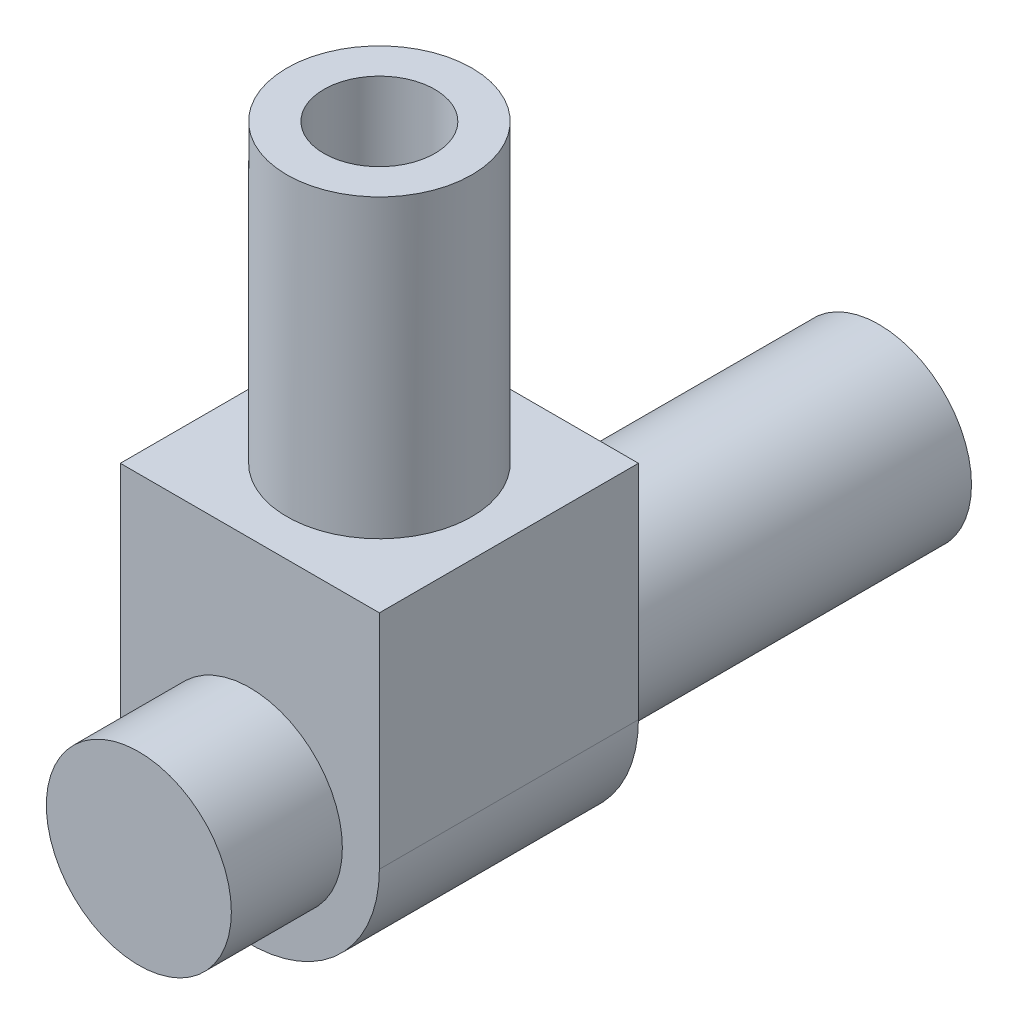
ISO-10303-21;
HEADER;
FILE_DESCRIPTION(('STEP AP214'),'2;1');
FILE_NAME('part.step','',(''),(''),'','','');
FILE_SCHEMA(('AUTOMOTIVE_DESIGN { 1 0 10303 214 1 1 1 1 }'));
ENDSEC;
DATA;
#1=APPLICATION_CONTEXT('core data for automotive mechanical design processes');
#2=APPLICATION_PROTOCOL_DEFINITION('international standard','automotive_design',2000,#1);
#3=PRODUCT_CONTEXT('',#1,'mechanical');
#4=PRODUCT('Part','Part','',(#3));
#5=PRODUCT_RELATED_PRODUCT_CATEGORY('part','',(#4));
#6=PRODUCT_DEFINITION_FORMATION('','',#4);
#7=PRODUCT_DEFINITION_CONTEXT('part definition',#1,'design');
#8=PRODUCT_DEFINITION('design','',#6,#7);
#9=PRODUCT_DEFINITION_SHAPE('','',#8);
#10=(LENGTH_UNIT() NAMED_UNIT(*) SI_UNIT(.MILLI.,.METRE.));
#11=(NAMED_UNIT(*) PLANE_ANGLE_UNIT() SI_UNIT($,.RADIAN.));
#12=(NAMED_UNIT(*) SI_UNIT($,.STERADIAN.) SOLID_ANGLE_UNIT());
#13=UNCERTAINTY_MEASURE_WITH_UNIT(LENGTH_MEASURE(1.E-05),#10,'distance_accuracy_value','');
#14=(GEOMETRIC_REPRESENTATION_CONTEXT(3) GLOBAL_UNCERTAINTY_ASSIGNED_CONTEXT((#13)) GLOBAL_UNIT_ASSIGNED_CONTEXT((#10,
#11,#12)) REPRESENTATION_CONTEXT('',''));
#15=CARTESIAN_POINT('',(0.,0.,0.));
#16=DIRECTION('',(0.,0.,1.));
#17=DIRECTION('',(1.,0.,0.));
#18=AXIS2_PLACEMENT_3D('',#15,#16,#17);
#19=CARTESIAN_POINT('',(-3.5,6.,7.));
#20=DIRECTION('',(0.,-1.,0.));
#21=DIRECTION('',(0.,0.,-1.));
#22=AXIS2_PLACEMENT_3D('',#19,#20,#21);
#23=PLANE('',#22);
#24=DIRECTION('',(-1.,0.,0.));
#25=VECTOR('',#24,1.);
#26=CARTESIAN_POINT('',(-3.5,6.,0.));
#27=LINE('',#26,#25);
#28=CARTESIAN_POINT('',(3.5,6.,0.));
#29=VERTEX_POINT('',#28);
#30=CARTESIAN_POINT('',(-3.5,6.,0.));
#31=VERTEX_POINT('',#30);
#32=EDGE_CURVE('E71',#29,#31,#27,.T.);
#33=ORIENTED_EDGE('',*,*,#32,.T.);
#34=DIRECTION('',(0.,0.,-1.));
#35=VECTOR('',#34,1.);
#36=CARTESIAN_POINT('',(-3.5,6.,7.));
#37=LINE('',#36,#35);
#38=CARTESIAN_POINT('',(-3.5,6.,7.));
#39=VERTEX_POINT('',#38);
#40=EDGE_CURVE('E98',#39,#31,#37,.T.);
#41=ORIENTED_EDGE('',*,*,#40,.F.);
#42=DIRECTION('',(-1.,0.,0.));
#43=VECTOR('',#42,1.);
#44=CARTESIAN_POINT('',(-3.5,6.,7.));
#45=LINE('',#44,#43);
#46=CARTESIAN_POINT('',(3.5,6.,7.));
#47=VERTEX_POINT('',#46);
#48=EDGE_CURVE('E89',#47,#39,#45,.T.);
#49=ORIENTED_EDGE('',*,*,#48,.F.);
#50=DIRECTION('',(0.,0.,-1.));
#51=VECTOR('',#50,1.);
#52=CARTESIAN_POINT('',(3.5,6.,7.));
#53=LINE('',#52,#51);
#54=EDGE_CURVE('E94',#47,#29,#53,.T.);
#55=ORIENTED_EDGE('',*,*,#54,.T.);
#56=EDGE_LOOP('',(#33,#41,#49,#55));
#57=FACE_BOUND('',#56,.T.);
#58=CARTESIAN_POINT('',(0.,6.,3.5));
#59=DIRECTION('',(0.,-1.,0.));
#60=DIRECTION('',(0.,0.,-1.));
#61=AXIS2_PLACEMENT_3D('',#58,#59,#60);
#62=CIRCLE('',#61,2.5);
#63=CARTESIAN_POINT('',(0.,6.,1.));
#64=VERTEX_POINT('',#63);
#65=EDGE_CURVE('E46',#64,#64,#62,.F.);
#66=ORIENTED_EDGE('',*,*,#65,.F.);
#67=EDGE_LOOP('',(#66));
#68=FACE_BOUND('',#67,.T.);
#69=ADVANCED_FACE('F33',(#57,#68),#23,.F.);
#70=CARTESIAN_POINT('',(0.,0.,0.));
#71=DIRECTION('',(0.,0.,1.));
#72=DIRECTION('',(1.,0.,0.));
#73=AXIS2_PLACEMENT_3D('',#70,#71,#72);
#74=PLANE('',#73);
#75=CARTESIAN_POINT('',(0.,0.,0.));
#76=DIRECTION('',(0.,0.,1.));
#77=DIRECTION('',(1.,0.,0.));
#78=AXIS2_PLACEMENT_3D('',#75,#76,#77);
#79=CIRCLE('',#78,3.5);
#80=CARTESIAN_POINT('',(-3.5,0.,0.));
#81=VERTEX_POINT('',#80);
#82=CARTESIAN_POINT('',(3.5,0.,0.));
#83=VERTEX_POINT('',#82);
#84=EDGE_CURVE('E106',#81,#83,#79,.T.);
#85=ORIENTED_EDGE('',*,*,#84,.F.);
#86=DIRECTION('',(0.,-1.,0.));
#87=VECTOR('',#86,1.);
#88=CARTESIAN_POINT('',(-3.5,0.,0.));
#89=LINE('',#88,#87);
#90=EDGE_CURVE('E77',#31,#81,#89,.T.);
#91=ORIENTED_EDGE('',*,*,#90,.F.);
#92=ORIENTED_EDGE('',*,*,#32,.F.);
#93=DIRECTION('',(0.,1.,0.));
#94=VECTOR('',#93,1.);
#95=CARTESIAN_POINT('',(3.5,6.,0.));
#96=LINE('',#95,#94);
#97=EDGE_CURVE('E96',#83,#29,#96,.T.);
#98=ORIENTED_EDGE('',*,*,#97,.F.);
#99=EDGE_LOOP('',(#85,#91,#92,#98));
#100=FACE_BOUND('',#99,.T.);
#101=CARTESIAN_POINT('',(0.,0.,0.));
#102=DIRECTION('',(0.,0.,1.));
#103=DIRECTION('',(1.,0.,0.));
#104=AXIS2_PLACEMENT_3D('',#101,#102,#103);
#105=CIRCLE('',#104,2.5);
#106=CARTESIAN_POINT('',(2.5,0.,0.));
#107=VERTEX_POINT('',#106);
#108=EDGE_CURVE('E116',#107,#107,#105,.F.);
#109=ORIENTED_EDGE('',*,*,#108,.F.);
#110=EDGE_LOOP('',(#109));
#111=FACE_BOUND('',#110,.T.);
#112=ADVANCED_FACE('F123',(#100,#111),#74,.F.);
#113=CARTESIAN_POINT('',(0.,0.,7.));
#114=DIRECTION('',(0.,0.,1.));
#115=DIRECTION('',(1.,0.,0.));
#116=AXIS2_PLACEMENT_3D('',#113,#114,#115);
#117=PLANE('',#116);
#118=CARTESIAN_POINT('',(0.,0.,7.));
#119=DIRECTION('',(0.,0.,1.));
#120=DIRECTION('',(1.,0.,0.));
#121=AXIS2_PLACEMENT_3D('',#118,#119,#120);
#122=CIRCLE('',#121,3.5);
#123=CARTESIAN_POINT('',(-3.5,0.,7.));
#124=VERTEX_POINT('',#123);
#125=CARTESIAN_POINT('',(3.5,0.,7.));
#126=VERTEX_POINT('',#125);
#127=EDGE_CURVE('E91',#124,#126,#122,.T.);
#128=ORIENTED_EDGE('',*,*,#127,.T.);
#129=DIRECTION('',(0.,1.,0.));
#130=VECTOR('',#129,1.);
#131=CARTESIAN_POINT('',(3.5,6.,7.));
#132=LINE('',#131,#130);
#133=EDGE_CURVE('E85',#126,#47,#132,.T.);
#134=ORIENTED_EDGE('',*,*,#133,.T.);
#135=ORIENTED_EDGE('',*,*,#48,.T.);
#136=DIRECTION('',(0.,-1.,0.));
#137=VECTOR('',#136,1.);
#138=CARTESIAN_POINT('',(-3.5,0.,7.));
#139=LINE('',#138,#137);
#140=EDGE_CURVE('E54',#39,#124,#139,.T.);
#141=ORIENTED_EDGE('',*,*,#140,.T.);
#142=EDGE_LOOP('',(#128,#134,#135,#141));
#143=FACE_BOUND('',#142,.T.);
#144=CARTESIAN_POINT('',(0.,0.,7.));
#145=DIRECTION('',(0.,0.,1.));
#146=DIRECTION('',(1.,0.,0.));
#147=AXIS2_PLACEMENT_3D('',#144,#145,#146);
#148=CIRCLE('',#147,2.5);
#149=CARTESIAN_POINT('',(2.5,0.,7.));
#150=VERTEX_POINT('',#149);
#151=EDGE_CURVE('E176',#150,#150,#148,.T.);
#152=ORIENTED_EDGE('',*,*,#151,.F.);
#153=EDGE_LOOP('',(#152));
#154=FACE_BOUND('',#153,.T.);
#155=ADVANCED_FACE('F86',(#143,#154),#117,.T.);
#156=CARTESIAN_POINT('',(0.,0.,7.));
#157=DIRECTION('',(0.,0.,-1.));
#158=DIRECTION('',(-1.,0.,0.));
#159=AXIS2_PLACEMENT_3D('',#156,#157,#158);
#160=CYLINDRICAL_SURFACE('',#159,3.5);
#161=CARTESIAN_POINT('',(0.,-3.5,5.));
#162=CARTESIAN_POINT('',(0.0801521976824057,-3.49999299268884,4.99999077856102));
#163=CARTESIAN_POINT('',(0.160419992198245,-3.4972151640971,4.9935378702444));
#164=CARTESIAN_POINT('',(0.318671611361215,-3.48637069204865,4.96796029271462));
#165=CARTESIAN_POINT('',(0.396649149090578,-3.47829069608751,4.94880363021045));
#166=CARTESIAN_POINT('',(0.547768164746412,-3.45770786336707,4.89866472480102));
#167=CARTESIAN_POINT('',(0.620925386146736,-3.44522036823866,4.86772347253735));
#168=CARTESIAN_POINT('',(0.760936446071886,-3.41702837926819,4.79506789624952));
#169=CARTESIAN_POINT('',(0.827791985611416,-3.40132475720839,4.75335649084902));
#170=CARTESIAN_POINT('',(0.956920783546127,-3.36733908702934,4.65803614587467));
#171=CARTESIAN_POINT('',(1.01882024425246,-3.34896947381213,4.60395236192237));
#172=CARTESIAN_POINT('',(1.13299518436931,-3.3120882776969,4.48642807388386));
#173=CARTESIAN_POINT('',(1.18526532055665,-3.29357662187922,4.42298240992972));
#174=CARTESIAN_POINT('',(1.28142843548186,-3.25741027462364,4.28448363629348));
#175=CARTESIAN_POINT('',(1.32473406006014,-3.23985230076501,4.20899477035753));
#176=CARTESIAN_POINT('',(1.39786599574425,-3.2089808436345,4.05094528653299));
#177=CARTESIAN_POINT('',(1.42769964537364,-3.19566505070703,3.96838854791987));
#178=CARTESIAN_POINT('',(1.47147459991436,-3.17573899533535,3.80284963069055));
#179=CARTESIAN_POINT('',(1.48613747209695,-3.16882610719817,3.72009614907264));
#180=CARTESIAN_POINT('',(1.50140303570396,-3.16162424842019,3.55303701523244));
#181=CARTESIAN_POINT('',(1.50201414304565,-3.16133131294301,3.46873232235007));
#182=CARTESIAN_POINT('',(1.48969999758096,-3.16714786968021,3.30835004815122));
#183=CARTESIAN_POINT('',(1.47788056910827,-3.17273435527608,3.23216468839374));
#184=CARTESIAN_POINT('',(1.44290386406528,-3.18879205821456,3.08298620711097));
#185=CARTESIAN_POINT('',(1.41974426417223,-3.19926427650311,3.00999374307123));
#186=CARTESIAN_POINT('',(1.36228829534658,-3.22415342810443,2.86737642426223));
#187=CARTESIAN_POINT('',(1.32775987214028,-3.23865147551049,2.79785985288551));
#188=CARTESIAN_POINT('',(1.24871152436691,-3.26994246945713,2.66532683797071));
#189=CARTESIAN_POINT('',(1.20418753740296,-3.28673634798109,2.60231305253676));
#190=CARTESIAN_POINT('',(1.10171702696058,-3.32256202266195,2.47861124818766));
#191=CARTESIAN_POINT('',(1.04292364428052,-3.34165927694226,2.41864163526357));
#192=CARTESIAN_POINT('',(0.915936662025533,-3.3786730287964,2.30916420467247));
#193=CARTESIAN_POINT('',(0.847740608139989,-3.39658921627429,2.25965912706102));
#194=CARTESIAN_POINT('',(0.701592911506315,-3.4297984684468,2.17137803359639));
#195=CARTESIAN_POINT('',(0.623435574851147,-3.44501227516835,2.13291049064718));
#196=CARTESIAN_POINT('',(0.460939847079478,-3.47048698130307,2.06992488119267));
#197=CARTESIAN_POINT('',(0.376605107828833,-3.48075078019997,2.04539864701116));
#198=CARTESIAN_POINT('',(0.210138119470685,-3.49461763446686,2.01253306977051));
#199=CARTESIAN_POINT('',(0.12822898050547,-3.49861624982293,2.00323061734281));
#200=CARTESIAN_POINT('',(-0.0360716505592618,-3.50077708325871,1.99818521179588));
#201=CARTESIAN_POINT('',(-0.118462985950311,-3.49894110265833,2.0024380737338));
#202=CARTESIAN_POINT('',(-0.276771219813305,-3.48989338160075,2.02370781602742));
#203=CARTESIAN_POINT('',(-0.352799465751996,-3.48297259736823,2.0400341607242));
#204=CARTESIAN_POINT('',(-0.500945568196324,-3.46476944004986,2.08401044711904));
#205=CARTESIAN_POINT('',(-0.573062936850433,-3.45348652424256,2.11166179786093));
#206=CARTESIAN_POINT('',(-0.713888482619006,-3.42719375756864,2.17840057975122));
#207=CARTESIAN_POINT('',(-0.782419874757532,-3.41207852694255,2.21781816511362));
#208=CARTESIAN_POINT('',(-0.912142452825177,-3.37971494195701,2.30660947223738));
#209=CARTESIAN_POINT('',(-0.973330487571132,-3.36246567824312,2.35598744400943));
#210=CARTESIAN_POINT('',(-1.09148379765634,-3.32607394349023,2.46764479392383));
#211=CARTESIAN_POINT('',(-1.14778308774279,-3.30688677499573,2.53061610503989));
#212=CARTESIAN_POINT('',(-1.24921715724402,-3.26992018844849,2.66539114930661));
#213=CARTESIAN_POINT('',(-1.29434883220193,-3.25214116277359,2.737197330153));
#214=CARTESIAN_POINT('',(-1.37281937806384,-3.21981484643715,2.88940692651431));
#215=CARTESIAN_POINT('',(-1.40593207473353,-3.20533127997694,2.96994150465684));
#216=CARTESIAN_POINT('',(-1.45782942550893,-3.18206803761103,3.13626316323802));
#217=CARTESIAN_POINT('',(-1.47662682249981,-3.17328328988834,3.22204549867058));
#218=CARTESIAN_POINT('',(-1.49805974083905,-3.16321740581935,3.38899558661863));
#219=CARTESIAN_POINT('',(-1.50187346166243,-3.1613896288168,3.46997963537981));
#220=CARTESIAN_POINT('',(-1.49641325085791,-3.16397809086751,3.63139487183152));
#221=CARTESIAN_POINT('',(-1.48714162748686,-3.16839322866983,3.7118261545153));
#222=CARTESIAN_POINT('',(-1.45678214099438,-3.1824582711803,3.86552085386623));
#223=CARTESIAN_POINT('',(-1.43633482013379,-3.19182357178317,3.93893941664732));
#224=CARTESIAN_POINT('',(-1.38485117000437,-3.21449437287189,4.08131036217406));
#225=CARTESIAN_POINT('',(-1.35381183006239,-3.22780099349552,4.15026146845329));
#226=CARTESIAN_POINT('',(-1.27981602227022,-3.25787626150961,4.2864104369083));
#227=CARTESIAN_POINT('',(-1.23624027712768,-3.2748083433963,4.35323489382022));
#228=CARTESIAN_POINT('',(-1.13924888881305,-3.3097987990854,4.47899086353089));
#229=CARTESIAN_POINT('',(-1.08582952534294,-3.32785759700647,4.53791937754398));
#230=CARTESIAN_POINT('',(-0.965671675541754,-3.36477750877144,4.65100309731437));
#231=CARTESIAN_POINT('',(-0.898214817981347,-3.38358948911939,4.70441473386853));
#232=CARTESIAN_POINT('',(-0.754612613706939,-3.41848089249468,4.79921492669314));
#233=CARTESIAN_POINT('',(-0.678463349382714,-3.43455907522587,4.84059803174978));
#234=CARTESIAN_POINT('',(-0.520626802896574,-3.46197513636854,4.90934456957067));
#235=CARTESIAN_POINT('',(-0.4390364028582,-3.47337868320289,4.93690352997931));
#236=CARTESIAN_POINT('',(-0.27192565740434,-3.49042295491408,4.9776347147672));
#237=CARTESIAN_POINT('',(-0.186418352711328,-3.49608152963086,4.99085150964664));
#238=CARTESIAN_POINT('',(-0.0670267606132215,-3.49952115812385,4.99888051095403));
#239=CARTESIAN_POINT('',(-0.0335234910607521,-3.50000293079341,5.0000038568478));
#240=CARTESIAN_POINT('',(0.,-3.5,5.));
#241=B_SPLINE_CURVE_WITH_KNOTS('',3,(#161,#162,#163,#164,#165,#166,#167,#168,#169,#170,#171,
#172,#173,#174,#175,#176,#177,#178,#179,#180,#181,#182,#183,#184,#185,#186,#187,#188,#189,#190,
#191,#192,#193,#194,#195,#196,#197,#198,#199,#200,#201,#202,#203,#204,#205,#206,#207,#208,#209,
#210,#211,#212,#213,#214,#215,#216,#217,#218,#219,#220,#221,#222,#223,#224,#225,#226,#227,#228,
#229,#230,#231,#232,#233,#234,#235,#236,#237,#238,#239,#240),.UNSPECIFIED.,.T.,.F.,(4,2,2,2,2,2,
2,2,2,2,2,2,2,2,2,2,2,2,2,2,2,2,2,2,2,2,2,2,2,2,2,2,2,2,2,2,2,2,2,4),(0.,0.240357161374425,
0.481321951711673,0.721456131375708,0.961525304807656,1.21311371779253,1.46484131710872,
1.72984780430031,1.99470976114131,2.2462971341405,2.49773382188957,2.72855360159806,
2.95942069041216,3.19532704432402,3.43132944942385,3.68854918859162,3.94583619550723,
4.20973622296859,4.47348148178613,4.71978673747256,4.96601595851026,5.19915597113058,
5.43232499957122,5.67277527577345,5.91332836788289,6.17201425189602,6.43077196675482,
6.69417345394932,6.95734019712949,7.19934244432577,7.44130200762144,7.67066022550943,
7.90008369050324,8.14372375039558,8.38745608120077,8.65042084666959,8.91350460007056,
9.17275427816965,9.43119596989053,9.5317248559811),.UNSPECIFIED.);
#242=CARTESIAN_POINT('',(0.,-3.5,5.));
#243=VERTEX_POINT('',#242);
#244=EDGE_CURVE('E11',#243,#243,#241,.T.);
#245=ORIENTED_EDGE('',*,*,#244,.T.);
#246=EDGE_LOOP('',(#245));
#247=FACE_BOUND('',#246,.T.);
#248=ORIENTED_EDGE('',*,*,#84,.T.);
#249=DIRECTION('',(0.,0.,-1.));
#250=VECTOR('',#249,1.);
#251=CARTESIAN_POINT('',(3.5,0.,7.));
#252=LINE('',#251,#250);
#253=EDGE_CURVE('E97',#126,#83,#252,.T.);
#254=ORIENTED_EDGE('',*,*,#253,.F.);
#255=ORIENTED_EDGE('',*,*,#127,.F.);
#256=DIRECTION('',(0.,0.,-1.));
#257=VECTOR('',#256,1.);
#258=CARTESIAN_POINT('',(-3.5,0.,7.));
#259=LINE('',#258,#257);
#260=EDGE_CURVE('E102',#124,#81,#259,.T.);
#261=ORIENTED_EDGE('',*,*,#260,.T.);
#262=EDGE_LOOP('',(#248,#254,#255,#261));
#263=FACE_BOUND('',#262,.T.);
#264=ADVANCED_FACE('F35',(#247,#263),#160,.T.);
#265=CARTESIAN_POINT('',(3.5,6.,7.));
#266=DIRECTION('',(-1.,0.,0.));
#267=DIRECTION('',(0.,-1.,0.));
#268=AXIS2_PLACEMENT_3D('',#265,#266,#267);
#269=PLANE('',#268);
#270=ORIENTED_EDGE('',*,*,#97,.T.);
#271=ORIENTED_EDGE('',*,*,#54,.F.);
#272=ORIENTED_EDGE('',*,*,#133,.F.);
#273=ORIENTED_EDGE('',*,*,#253,.T.);
#274=EDGE_LOOP('',(#270,#271,#272,#273));
#275=FACE_BOUND('',#274,.T.);
#276=ADVANCED_FACE('F95',(#275),#269,.F.);
#277=CARTESIAN_POINT('',(-3.5,0.,7.));
#278=DIRECTION('',(1.,0.,0.));
#279=DIRECTION('',(0.,1.,0.));
#280=AXIS2_PLACEMENT_3D('',#277,#278,#279);
#281=PLANE('',#280);
#282=ORIENTED_EDGE('',*,*,#90,.T.);
#283=ORIENTED_EDGE('',*,*,#260,.F.);
#284=ORIENTED_EDGE('',*,*,#140,.F.);
#285=ORIENTED_EDGE('',*,*,#40,.T.);
#286=EDGE_LOOP('',(#282,#283,#284,#285));
#287=FACE_BOUND('',#286,.T.);
#288=ADVANCED_FACE('F131',(#287),#281,.F.);
#289=CARTESIAN_POINT('',(0.,0.,10.));
#290=DIRECTION('',(0.,0.,-1.));
#291=DIRECTION('',(-1.,0.,0.));
#292=AXIS2_PLACEMENT_3D('',#289,#290,#291);
#293=CYLINDRICAL_SURFACE('',#292,2.5);
#294=CARTESIAN_POINT('',(0.,0.,10.));
#295=DIRECTION('',(0.,0.,1.));
#296=DIRECTION('',(1.,0.,0.));
#297=AXIS2_PLACEMENT_3D('',#294,#295,#296);
#298=CIRCLE('',#297,2.5);
#299=CARTESIAN_POINT('',(2.5,0.,10.));
#300=VERTEX_POINT('',#299);
#301=EDGE_CURVE('E109',#300,#300,#298,.T.);
#302=ORIENTED_EDGE('',*,*,#301,.F.);
#303=EDGE_LOOP('',(#302));
#304=FACE_BOUND('',#303,.T.);
#305=ORIENTED_EDGE('',*,*,#151,.T.);
#306=EDGE_LOOP('',(#305));
#307=FACE_BOUND('',#306,.T.);
#308=ADVANCED_FACE('F137',(#304,#307),#293,.T.);
#309=CARTESIAN_POINT('',(0.,0.,10.));
#310=DIRECTION('',(0.,0.,1.));
#311=DIRECTION('',(1.,0.,0.));
#312=AXIS2_PLACEMENT_3D('',#309,#310,#311);
#313=PLANE('',#312);
#314=ORIENTED_EDGE('',*,*,#301,.T.);
#315=EDGE_LOOP('',(#314));
#316=FACE_BOUND('',#315,.T.);
#317=ADVANCED_FACE('F152',(#316),#313,.T.);
#318=CARTESIAN_POINT('',(0.,0.,-10.));
#319=DIRECTION('',(0.,0.,1.));
#320=DIRECTION('',(1.,0.,0.));
#321=AXIS2_PLACEMENT_3D('',#318,#319,#320);
#322=CYLINDRICAL_SURFACE('',#321,2.5);
#323=CARTESIAN_POINT('',(0.,0.,-10.));
#324=DIRECTION('',(0.,0.,-1.));
#325=DIRECTION('',(-1.,0.,0.));
#326=AXIS2_PLACEMENT_3D('',#323,#324,#325);
#327=CIRCLE('',#326,2.5);
#328=CARTESIAN_POINT('',(-2.5,0.,-10.));
#329=VERTEX_POINT('',#328);
#330=EDGE_CURVE('E177',#329,#329,#327,.T.);
#331=ORIENTED_EDGE('',*,*,#330,.F.);
#332=EDGE_LOOP('',(#331));
#333=FACE_BOUND('',#332,.T.);
#334=ORIENTED_EDGE('',*,*,#108,.T.);
#335=EDGE_LOOP('',(#334));
#336=FACE_BOUND('',#335,.T.);
#337=ADVANCED_FACE('F149',(#333,#336),#322,.T.);
#338=CARTESIAN_POINT('',(0.,0.,-10.));
#339=DIRECTION('',(0.,0.,-1.));
#340=DIRECTION('',(-1.,0.,0.));
#341=AXIS2_PLACEMENT_3D('',#338,#339,#340);
#342=PLANE('',#341);
#343=ORIENTED_EDGE('',*,*,#330,.T.);
#344=EDGE_LOOP('',(#343));
#345=FACE_BOUND('',#344,.T.);
#346=ADVANCED_FACE('F151',(#345),#342,.T.);
#347=CARTESIAN_POINT('',(0.,14.,3.5));
#348=DIRECTION('',(0.,1.,0.));
#349=DIRECTION('',(0.,0.,1.));
#350=AXIS2_PLACEMENT_3D('',#347,#348,#349);
#351=PLANE('',#350);
#352=CARTESIAN_POINT('',(0.,14.,3.5));
#353=DIRECTION('',(0.,1.,0.));
#354=DIRECTION('',(0.,0.,1.));
#355=AXIS2_PLACEMENT_3D('',#352,#353,#354);
#356=CIRCLE('',#355,2.5);
#357=CARTESIAN_POINT('',(0.,14.,6.));
#358=VERTEX_POINT('',#357);
#359=EDGE_CURVE('E181',#358,#358,#356,.T.);
#360=ORIENTED_EDGE('',*,*,#359,.T.);
#361=EDGE_LOOP('',(#360));
#362=FACE_BOUND('',#361,.T.);
#363=CARTESIAN_POINT('',(0.,14.,3.5));
#364=DIRECTION('',(0.,1.,0.));
#365=DIRECTION('',(0.,0.,1.));
#366=AXIS2_PLACEMENT_3D('',#363,#364,#365);
#367=CIRCLE('',#366,1.5);
#368=CARTESIAN_POINT('',(0.,14.,5.));
#369=VERTEX_POINT('',#368);
#370=EDGE_CURVE('E186',#369,#369,#367,.T.);
#371=ORIENTED_EDGE('',*,*,#370,.F.);
#372=EDGE_LOOP('',(#371));
#373=FACE_BOUND('',#372,.T.);
#374=ADVANCED_FACE('F159',(#362,#373),#351,.T.);
#375=CARTESIAN_POINT('',(0.,14.,3.5));
#376=DIRECTION('',(0.,-1.,0.));
#377=DIRECTION('',(0.,0.,-1.));
#378=AXIS2_PLACEMENT_3D('',#375,#376,#377);
#379=CYLINDRICAL_SURFACE('',#378,2.5);
#380=ORIENTED_EDGE('',*,*,#359,.F.);
#381=EDGE_LOOP('',(#380));
#382=FACE_BOUND('',#381,.T.);
#383=ORIENTED_EDGE('',*,*,#65,.T.);
#384=EDGE_LOOP('',(#383));
#385=FACE_BOUND('',#384,.T.);
#386=ADVANCED_FACE('F121',(#382,#385),#379,.T.);
#387=CARTESIAN_POINT('',(0.,14.,3.5));
#388=DIRECTION('',(0.,-1.,0.));
#389=DIRECTION('',(0.,0.,-1.));
#390=AXIS2_PLACEMENT_3D('',#387,#388,#389);
#391=CYLINDRICAL_SURFACE('',#390,1.5);
#392=ORIENTED_EDGE('',*,*,#370,.T.);
#393=EDGE_LOOP('',(#392));
#394=FACE_BOUND('',#393,.T.);
#395=ORIENTED_EDGE('',*,*,#244,.F.);
#396=EDGE_LOOP('',(#395));
#397=FACE_BOUND('',#396,.T.);
#398=ADVANCED_FACE('F190',(#394,#397),#391,.F.);
#399=CLOSED_SHELL('',(#69,#112,#155,#264,#276,#288,#308,#317,#337,#346,#374,#386,#398));
#400=MANIFOLD_SOLID_BREP('B2',#399);
#401=ADVANCED_BREP_SHAPE_REPRESENTATION('',(#18,#400),#14);
#402=SHAPE_DEFINITION_REPRESENTATION(#9,#401);
ENDSEC;
END-ISO-10303-21;
